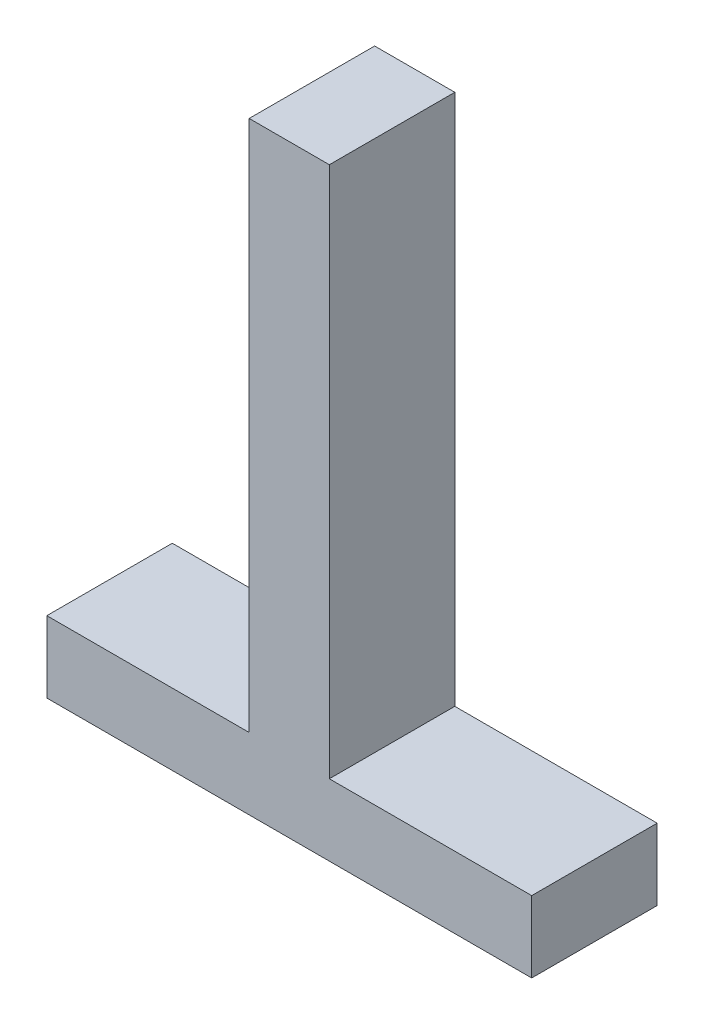
ISO-10303-21;
HEADER;
FILE_DESCRIPTION(('STEP AP214'),'2;1');
FILE_NAME('part.step','',(''),(''),'','','');
FILE_SCHEMA(('AUTOMOTIVE_DESIGN { 1 0 10303 214 1 1 1 1 }'));
ENDSEC;
DATA;
#1=APPLICATION_CONTEXT('core data for automotive mechanical design processes');
#2=APPLICATION_PROTOCOL_DEFINITION('international standard','automotive_design',2000,#1);
#3=PRODUCT_CONTEXT('',#1,'mechanical');
#4=PRODUCT('Part','Part','',(#3));
#5=PRODUCT_RELATED_PRODUCT_CATEGORY('part','',(#4));
#6=PRODUCT_DEFINITION_FORMATION('','',#4);
#7=PRODUCT_DEFINITION_CONTEXT('part definition',#1,'design');
#8=PRODUCT_DEFINITION('design','',#6,#7);
#9=PRODUCT_DEFINITION_SHAPE('','',#8);
#10=(LENGTH_UNIT() NAMED_UNIT(*) SI_UNIT(.MILLI.,.METRE.));
#11=(NAMED_UNIT(*) PLANE_ANGLE_UNIT() SI_UNIT($,.RADIAN.));
#12=(NAMED_UNIT(*) SI_UNIT($,.STERADIAN.) SOLID_ANGLE_UNIT());
#13=UNCERTAINTY_MEASURE_WITH_UNIT(LENGTH_MEASURE(1.E-05),#10,'distance_accuracy_value','');
#14=(GEOMETRIC_REPRESENTATION_CONTEXT(3) GLOBAL_UNCERTAINTY_ASSIGNED_CONTEXT((#13)) GLOBAL_UNIT_ASSIGNED_CONTEXT((#10,
#11,#12)) REPRESENTATION_CONTEXT('',''));
#15=CARTESIAN_POINT('',(0.,0.,0.));
#16=DIRECTION('',(0.,0.,1.));
#17=DIRECTION('',(1.,0.,0.));
#18=AXIS2_PLACEMENT_3D('',#15,#16,#17);
#19=CARTESIAN_POINT('',(-5.594912749196,-7.93075153549,0.));
#20=DIRECTION('',(0.,1.,0.));
#21=DIRECTION('',(-1.,0.,0.));
#22=AXIS2_PLACEMENT_3D('',#19,#20,#21);
#23=PLANE('',#22);
#24=DIRECTION('',(1.,0.,0.));
#25=VECTOR('',#24,1.);
#26=CARTESIAN_POINT('',(-5.756194691285,-7.93075153549,0.));
#27=LINE('',#26,#25);
#28=CARTESIAN_POINT('',(-5.756194691285,-7.93075153549,0.));
#29=VERTEX_POINT('',#28);
#30=CARTESIAN_POINT('',(-5.594912749196,-7.93075153549,0.));
#31=VERTEX_POINT('',#30);
#32=EDGE_CURVE('E11',#29,#31,#27,.T.);
#33=ORIENTED_EDGE('',*,*,#32,.F.);
#34=DIRECTION('',(0.,0.,1.));
#35=VECTOR('',#34,1.);
#36=CARTESIAN_POINT('',(-5.756194691285,-7.93075153549,0.));
#37=LINE('',#36,#35);
#38=CARTESIAN_POINT('',(-5.756194691285,-7.93075153549,0.1));
#39=VERTEX_POINT('',#38);
#40=EDGE_CURVE('E24',#29,#39,#37,.T.);
#41=ORIENTED_EDGE('',*,*,#40,.T.);
#42=DIRECTION('',(-1.,0.,0.));
#43=VECTOR('',#42,1.);
#44=CARTESIAN_POINT('',(-5.756194691285,-7.93075153549,0.1));
#45=LINE('',#44,#43);
#46=CARTESIAN_POINT('',(-5.594912749196,-7.93075153549,0.1));
#47=VERTEX_POINT('',#46);
#48=EDGE_CURVE('E100',#47,#39,#45,.T.);
#49=ORIENTED_EDGE('',*,*,#48,.F.);
#50=DIRECTION('',(0.,0.,1.));
#51=VECTOR('',#50,1.);
#52=CARTESIAN_POINT('',(-5.594912749196,-7.93075153549,0.));
#53=LINE('',#52,#51);
#54=EDGE_CURVE('E141',#31,#47,#53,.T.);
#55=ORIENTED_EDGE('',*,*,#54,.F.);
#56=EDGE_LOOP('',(#33,#41,#49,#55));
#57=FACE_BOUND('',#56,.T.);
#58=ADVANCED_FACE('F17',(#57),#23,.T.);
#59=CARTESIAN_POINT('',(-5.594912749196,-7.98762874212,0.));
#60=DIRECTION('',(1.,0.,0.));
#61=DIRECTION('',(0.,1.,0.));
#62=AXIS2_PLACEMENT_3D('',#59,#60,#61);
#63=PLANE('',#62);
#64=DIRECTION('',(0.,-1.,0.));
#65=VECTOR('',#64,1.);
#66=CARTESIAN_POINT('',(-5.594912749196,-7.93075153549,0.));
#67=LINE('',#66,#65);
#68=CARTESIAN_POINT('',(-5.594912749196,-7.98762874212,0.));
#69=VERTEX_POINT('',#68);
#70=EDGE_CURVE('E139',#31,#69,#67,.T.);
#71=ORIENTED_EDGE('',*,*,#70,.F.);
#72=ORIENTED_EDGE('',*,*,#54,.T.);
#73=DIRECTION('',(0.,1.,0.));
#74=VECTOR('',#73,1.);
#75=CARTESIAN_POINT('',(-5.594912749196,-7.93075153549,0.1));
#76=LINE('',#75,#74);
#77=CARTESIAN_POINT('',(-5.594912749196,-7.98762874212,0.1));
#78=VERTEX_POINT('',#77);
#79=EDGE_CURVE('E137',#78,#47,#76,.T.);
#80=ORIENTED_EDGE('',*,*,#79,.F.);
#81=DIRECTION('',(0.,0.,1.));
#82=VECTOR('',#81,1.);
#83=CARTESIAN_POINT('',(-5.594912749196,-7.98762874212,0.));
#84=LINE('',#83,#82);
#85=EDGE_CURVE('E134',#69,#78,#84,.T.);
#86=ORIENTED_EDGE('',*,*,#85,.F.);
#87=EDGE_LOOP('',(#71,#72,#80,#86));
#88=FACE_BOUND('',#87,.T.);
#89=ADVANCED_FACE('F163',(#88),#63,.T.);
#90=CARTESIAN_POINT('',(-5.981366098357,-7.98762874212,0.));
#91=DIRECTION('',(0.,-1.,0.));
#92=DIRECTION('',(1.,0.,0.));
#93=AXIS2_PLACEMENT_3D('',#90,#91,#92);
#94=PLANE('',#93);
#95=DIRECTION('',(-1.,0.,0.));
#96=VECTOR('',#95,1.);
#97=CARTESIAN_POINT('',(-5.594912749196,-7.98762874212,0.));
#98=LINE('',#97,#96);
#99=CARTESIAN_POINT('',(-5.981366098357,-7.98762874212,0.));
#100=VERTEX_POINT('',#99);
#101=EDGE_CURVE('E132',#69,#100,#98,.T.);
#102=ORIENTED_EDGE('',*,*,#101,.F.);
#103=ORIENTED_EDGE('',*,*,#85,.T.);
#104=DIRECTION('',(1.,0.,0.));
#105=VECTOR('',#104,1.);
#106=CARTESIAN_POINT('',(-5.594912749196,-7.98762874212,0.1));
#107=LINE('',#106,#105);
#108=CARTESIAN_POINT('',(-5.981366098357,-7.98762874212,0.1));
#109=VERTEX_POINT('',#108);
#110=EDGE_CURVE('E129',#109,#78,#107,.T.);
#111=ORIENTED_EDGE('',*,*,#110,.F.);
#112=DIRECTION('',(0.,0.,1.));
#113=VECTOR('',#112,1.);
#114=CARTESIAN_POINT('',(-5.981366098357,-7.98762874212,0.));
#115=LINE('',#114,#113);
#116=EDGE_CURVE('E126',#100,#109,#115,.T.);
#117=ORIENTED_EDGE('',*,*,#116,.F.);
#118=EDGE_LOOP('',(#102,#103,#111,#117));
#119=FACE_BOUND('',#118,.T.);
#120=ADVANCED_FACE('F159',(#119),#94,.T.);
#121=CARTESIAN_POINT('',(-5.981366098357,-7.93075153549,0.));
#122=DIRECTION('',(-1.,0.,0.));
#123=DIRECTION('',(0.,-1.,0.));
#124=AXIS2_PLACEMENT_3D('',#121,#122,#123);
#125=PLANE('',#124);
#126=DIRECTION('',(0.,1.,0.));
#127=VECTOR('',#126,1.);
#128=CARTESIAN_POINT('',(-5.981366098357,-7.98762874212,0.));
#129=LINE('',#128,#127);
#130=CARTESIAN_POINT('',(-5.981366098357,-7.93075153549,0.));
#131=VERTEX_POINT('',#130);
#132=EDGE_CURVE('E124',#100,#131,#129,.T.);
#133=ORIENTED_EDGE('',*,*,#132,.F.);
#134=ORIENTED_EDGE('',*,*,#116,.T.);
#135=DIRECTION('',(0.,-1.,0.));
#136=VECTOR('',#135,1.);
#137=CARTESIAN_POINT('',(-5.981366098357,-7.98762874212,0.1));
#138=LINE('',#137,#136);
#139=CARTESIAN_POINT('',(-5.981366098357,-7.93075153549,0.1));
#140=VERTEX_POINT('',#139);
#141=EDGE_CURVE('E121',#140,#109,#138,.T.);
#142=ORIENTED_EDGE('',*,*,#141,.F.);
#143=DIRECTION('',(0.,0.,1.));
#144=VECTOR('',#143,1.);
#145=CARTESIAN_POINT('',(-5.981366098357,-7.93075153549,0.));
#146=LINE('',#145,#144);
#147=EDGE_CURVE('E118',#131,#140,#146,.T.);
#148=ORIENTED_EDGE('',*,*,#147,.F.);
#149=EDGE_LOOP('',(#133,#134,#142,#148));
#150=FACE_BOUND('',#149,.T.);
#151=ADVANCED_FACE('F155',(#150),#125,.T.);
#152=CARTESIAN_POINT('',(-5.820084156267,-7.93075153549,0.));
#153=DIRECTION('',(0.,1.,0.));
#154=DIRECTION('',(-1.,0.,0.));
#155=AXIS2_PLACEMENT_3D('',#152,#153,#154);
#156=PLANE('',#155);
#157=DIRECTION('',(1.,0.,0.));
#158=VECTOR('',#157,1.);
#159=CARTESIAN_POINT('',(-5.981366098357,-7.93075153549,0.));
#160=LINE('',#159,#158);
#161=CARTESIAN_POINT('',(-5.820084156267,-7.93075153549,0.));
#162=VERTEX_POINT('',#161);
#163=EDGE_CURVE('E116',#131,#162,#160,.T.);
#164=ORIENTED_EDGE('',*,*,#163,.F.);
#165=ORIENTED_EDGE('',*,*,#147,.T.);
#166=DIRECTION('',(-1.,0.,0.));
#167=VECTOR('',#166,1.);
#168=CARTESIAN_POINT('',(-5.981366098357,-7.93075153549,0.1));
#169=LINE('',#168,#167);
#170=CARTESIAN_POINT('',(-5.820084156267,-7.93075153549,0.1));
#171=VERTEX_POINT('',#170);
#172=EDGE_CURVE('E113',#171,#140,#169,.T.);
#173=ORIENTED_EDGE('',*,*,#172,.F.);
#174=DIRECTION('',(0.,0.,1.));
#175=VECTOR('',#174,1.);
#176=CARTESIAN_POINT('',(-5.820084156267,-7.93075153549,0.));
#177=LINE('',#176,#175);
#178=EDGE_CURVE('E110',#162,#171,#177,.T.);
#179=ORIENTED_EDGE('',*,*,#178,.F.);
#180=EDGE_LOOP('',(#164,#165,#173,#179));
#181=FACE_BOUND('',#180,.T.);
#182=ADVANCED_FACE('F151',(#181),#156,.T.);
#183=CARTESIAN_POINT('',(-5.820084156267,-7.506899475119,0.));
#184=DIRECTION('',(-1.,0.,0.));
#185=DIRECTION('',(0.,-1.,0.));
#186=AXIS2_PLACEMENT_3D('',#183,#184,#185);
#187=PLANE('',#186);
#188=DIRECTION('',(0.,1.,0.));
#189=VECTOR('',#188,1.);
#190=CARTESIAN_POINT('',(-5.820084156267,-7.93075153549,0.));
#191=LINE('',#190,#189);
#192=CARTESIAN_POINT('',(-5.820084156267,-7.506899475119,0.));
#193=VERTEX_POINT('',#192);
#194=EDGE_CURVE('E108',#162,#193,#191,.T.);
#195=ORIENTED_EDGE('',*,*,#194,.F.);
#196=ORIENTED_EDGE('',*,*,#178,.T.);
#197=DIRECTION('',(0.,-1.,0.));
#198=VECTOR('',#197,1.);
#199=CARTESIAN_POINT('',(-5.820084156267,-7.93075153549,0.1));
#200=LINE('',#199,#198);
#201=CARTESIAN_POINT('',(-5.820084156267,-7.506899475119,0.1));
#202=VERTEX_POINT('',#201);
#203=EDGE_CURVE('E106',#202,#171,#200,.T.);
#204=ORIENTED_EDGE('',*,*,#203,.F.);
#205=DIRECTION('',(0.,0.,1.));
#206=VECTOR('',#205,1.);
#207=CARTESIAN_POINT('',(-5.820084156267,-7.506899475119,0.));
#208=LINE('',#207,#206);
#209=EDGE_CURVE('E85',#193,#202,#208,.T.);
#210=ORIENTED_EDGE('',*,*,#209,.F.);
#211=EDGE_LOOP('',(#195,#196,#204,#210));
#212=FACE_BOUND('',#211,.T.);
#213=ADVANCED_FACE('F149',(#212),#187,.T.);
#214=CARTESIAN_POINT('',(-5.756194691285,-7.506899475119,0.));
#215=DIRECTION('',(0.,1.,0.));
#216=DIRECTION('',(-1.,0.,0.));
#217=AXIS2_PLACEMENT_3D('',#214,#215,#216);
#218=PLANE('',#217);
#219=DIRECTION('',(1.,0.,0.));
#220=VECTOR('',#219,1.);
#221=CARTESIAN_POINT('',(-5.820084156267,-7.506899475119,0.));
#222=LINE('',#221,#220);
#223=CARTESIAN_POINT('',(-5.756194691285,-7.506899475119,0.));
#224=VERTEX_POINT('',#223);
#225=EDGE_CURVE('E89',#193,#224,#222,.T.);
#226=ORIENTED_EDGE('',*,*,#225,.F.);
#227=ORIENTED_EDGE('',*,*,#209,.T.);
#228=DIRECTION('',(-1.,0.,0.));
#229=VECTOR('',#228,1.);
#230=CARTESIAN_POINT('',(-5.820084156267,-7.506899475119,0.1));
#231=LINE('',#230,#229);
#232=CARTESIAN_POINT('',(-5.756194691285,-7.506899475119,0.1));
#233=VERTEX_POINT('',#232);
#234=EDGE_CURVE('E78',#233,#202,#231,.T.);
#235=ORIENTED_EDGE('',*,*,#234,.F.);
#236=DIRECTION('',(0.,0.,1.));
#237=VECTOR('',#236,1.);
#238=CARTESIAN_POINT('',(-5.756194691285,-7.506899475119,0.));
#239=LINE('',#238,#237);
#240=EDGE_CURVE('E82',#224,#233,#239,.T.);
#241=ORIENTED_EDGE('',*,*,#240,.F.);
#242=EDGE_LOOP('',(#226,#227,#235,#241));
#243=FACE_BOUND('',#242,.T.);
#244=ADVANCED_FACE('F81',(#243),#218,.T.);
#245=CARTESIAN_POINT('',(-5.756194691285,-7.93075153549,0.));
#246=DIRECTION('',(1.,0.,0.));
#247=DIRECTION('',(0.,1.,0.));
#248=AXIS2_PLACEMENT_3D('',#245,#246,#247);
#249=PLANE('',#248);
#250=DIRECTION('',(0.,-1.,0.));
#251=VECTOR('',#250,1.);
#252=CARTESIAN_POINT('',(-5.756194691285,-7.506899475119,0.));
#253=LINE('',#252,#251);
#254=EDGE_CURVE('E95',#224,#29,#253,.T.);
#255=ORIENTED_EDGE('',*,*,#254,.F.);
#256=ORIENTED_EDGE('',*,*,#240,.T.);
#257=DIRECTION('',(0.,1.,0.));
#258=VECTOR('',#257,1.);
#259=CARTESIAN_POINT('',(-5.756194691285,-7.506899475119,0.1));
#260=LINE('',#259,#258);
#261=EDGE_CURVE('E94',#39,#233,#260,.T.);
#262=ORIENTED_EDGE('',*,*,#261,.F.);
#263=ORIENTED_EDGE('',*,*,#40,.F.);
#264=EDGE_LOOP('',(#255,#256,#262,#263));
#265=FACE_BOUND('',#264,.T.);
#266=ADVANCED_FACE('F93',(#265),#249,.T.);
#267=CARTESIAN_POINT('',(-5.788139423776,-7.826093737098,0.));
#268=DIRECTION('',(0.,0.,1.));
#269=DIRECTION('',(1.,0.,0.));
#270=AXIS2_PLACEMENT_3D('',#267,#268,#269);
#271=PLANE('',#270);
#272=ORIENTED_EDGE('',*,*,#254,.T.);
#273=ORIENTED_EDGE('',*,*,#32,.T.);
#274=ORIENTED_EDGE('',*,*,#70,.T.);
#275=ORIENTED_EDGE('',*,*,#101,.T.);
#276=ORIENTED_EDGE('',*,*,#132,.T.);
#277=ORIENTED_EDGE('',*,*,#163,.T.);
#278=ORIENTED_EDGE('',*,*,#194,.T.);
#279=ORIENTED_EDGE('',*,*,#225,.T.);
#280=EDGE_LOOP('',(#272,#273,#274,#275,#276,#277,#278,#279));
#281=FACE_BOUND('',#280,.T.);
#282=ADVANCED_FACE('F144',(#281),#271,.F.);
#283=CARTESIAN_POINT('',(-5.788139423776,-7.826093737098,0.1));
#284=DIRECTION('',(0.,0.,1.));
#285=DIRECTION('',(1.,0.,0.));
#286=AXIS2_PLACEMENT_3D('',#283,#284,#285);
#287=PLANE('',#286);
#288=ORIENTED_EDGE('',*,*,#261,.T.);
#289=ORIENTED_EDGE('',*,*,#234,.T.);
#290=ORIENTED_EDGE('',*,*,#203,.T.);
#291=ORIENTED_EDGE('',*,*,#172,.T.);
#292=ORIENTED_EDGE('',*,*,#141,.T.);
#293=ORIENTED_EDGE('',*,*,#110,.T.);
#294=ORIENTED_EDGE('',*,*,#79,.T.);
#295=ORIENTED_EDGE('',*,*,#48,.T.);
#296=EDGE_LOOP('',(#288,#289,#290,#291,#292,#293,#294,#295));
#297=FACE_BOUND('',#296,.T.);
#298=ADVANCED_FACE('F98',(#297),#287,.T.);
#299=CLOSED_SHELL('',(#58,#89,#120,#151,#182,#213,#244,#266,#282,#298));
#300=MANIFOLD_SOLID_BREP('B1',#299);
#301=ADVANCED_BREP_SHAPE_REPRESENTATION('',(#18,#300),#14);
#302=SHAPE_DEFINITION_REPRESENTATION(#9,#301);
ENDSEC;
END-ISO-10303-21;
